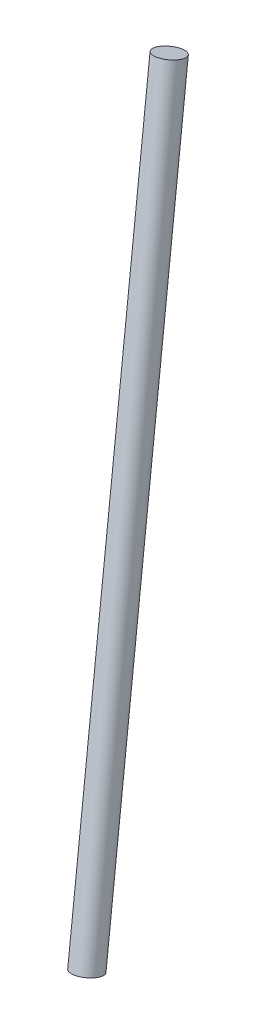
ISO-10303-21;
HEADER;
FILE_DESCRIPTION(('STEP AP214'),'2;1');
FILE_NAME('part.step','',(''),(''),'','','');
FILE_SCHEMA(('AUTOMOTIVE_DESIGN { 1 0 10303 214 1 1 1 1 }'));
ENDSEC;
DATA;
#1=APPLICATION_CONTEXT('core data for automotive mechanical design processes');
#2=APPLICATION_PROTOCOL_DEFINITION('international standard','automotive_design',2000,#1);
#3=PRODUCT_CONTEXT('',#1,'mechanical');
#4=PRODUCT('Part','Part','',(#3));
#5=PRODUCT_RELATED_PRODUCT_CATEGORY('part','',(#4));
#6=PRODUCT_DEFINITION_FORMATION('','',#4);
#7=PRODUCT_DEFINITION_CONTEXT('part definition',#1,'design');
#8=PRODUCT_DEFINITION('design','',#6,#7);
#9=PRODUCT_DEFINITION_SHAPE('','',#8);
#10=(LENGTH_UNIT() NAMED_UNIT(*) SI_UNIT(.MILLI.,.METRE.));
#11=(NAMED_UNIT(*) PLANE_ANGLE_UNIT() SI_UNIT($,.RADIAN.));
#12=(NAMED_UNIT(*) SI_UNIT($,.STERADIAN.) SOLID_ANGLE_UNIT());
#13=UNCERTAINTY_MEASURE_WITH_UNIT(LENGTH_MEASURE(1.E-05),#10,'distance_accuracy_value','');
#14=(GEOMETRIC_REPRESENTATION_CONTEXT(3) GLOBAL_UNCERTAINTY_ASSIGNED_CONTEXT((#13)) GLOBAL_UNIT_ASSIGNED_CONTEXT((#10,
#11,#12)) REPRESENTATION_CONTEXT('',''));
#15=CARTESIAN_POINT('',(0.,0.,0.));
#16=DIRECTION('',(0.,0.,1.));
#17=DIRECTION('',(1.,0.,0.));
#18=AXIS2_PLACEMENT_3D('',#15,#16,#17);
#19=CARTESIAN_POINT('',(4029.55687659563,695.574480356611,309.218380298336));
#20=DIRECTION('',(0.115598230222844,-0.965400157578288,0.233751117467196));
#21=DIRECTION('',(0.,-0.235328748896102,-0.971915829659645));
#22=AXIS2_PLACEMENT_3D('',#19,#20,#21);
#23=PLANE('',#22);
#24=CARTESIAN_POINT('',(4029.55687659563,695.574480356611,309.218380298336));
#25=DIRECTION('',(0.115598230222844,-0.965400157578288,0.233751117467196));
#26=DIRECTION('',(0.,-0.235328748896102,-0.971915829659645));
#27=AXIS2_PLACEMENT_3D('',#24,#25,#26);
#28=CIRCLE('',#27,7.50000000000011);
#29=CARTESIAN_POINT('',(4029.55687659563,693.80951473989,301.929011575888));
#30=VERTEX_POINT('',#29);
#31=EDGE_CURVE('E48',#30,#30,#28,.T.);
#32=ORIENTED_EDGE('',*,*,#31,.F.);
#33=EDGE_LOOP('',(#32));
#34=FACE_BOUND('',#33,.T.);
#35=ADVANCED_FACE('F41',(#34),#23,.F.);
#36=CARTESIAN_POINT('',(4074.02951192032,324.168369141819,399.14647161788));
#37=DIRECTION('',(0.115598230222844,-0.965400157578288,0.233751117467196));
#38=DIRECTION('',(0.,-0.235328748896102,-0.971915829659645));
#39=AXIS2_PLACEMENT_3D('',#36,#37,#38);
#40=PLANE('',#39);
#41=CARTESIAN_POINT('',(4074.02951192032,324.168369141819,399.14647161788));
#42=DIRECTION('',(0.115598230222844,-0.965400157578288,0.233751117467196));
#43=DIRECTION('',(0.,-0.235328748896102,-0.971915829659645));
#44=AXIS2_PLACEMENT_3D('',#41,#42,#43);
#45=CIRCLE('',#44,7.50000000000011);
#46=CARTESIAN_POINT('',(4074.02951192032,322.403403525098,391.857102895433));
#47=VERTEX_POINT('',#46);
#48=EDGE_CURVE('E12',#47,#47,#45,.T.);
#49=ORIENTED_EDGE('',*,*,#48,.T.);
#50=EDGE_LOOP('',(#49));
#51=FACE_BOUND('',#50,.T.);
#52=ADVANCED_FACE('F55',(#51),#40,.T.);
#53=CARTESIAN_POINT('',(4029.55687659563,695.574480356611,309.218380298336));
#54=DIRECTION('',(0.115598230222846,-0.965400157578288,0.233751117467195));
#55=DIRECTION('',(0.,-0.235328748896102,-0.971915829659645));
#56=AXIS2_PLACEMENT_3D('',#53,#54,#55);
#57=CYLINDRICAL_SURFACE('',#56,7.50000000000011);
#58=ORIENTED_EDGE('',*,*,#48,.F.);
#59=EDGE_LOOP('',(#58));
#60=FACE_BOUND('',#59,.T.);
#61=ORIENTED_EDGE('',*,*,#31,.T.);
#62=EDGE_LOOP('',(#61));
#63=FACE_BOUND('',#62,.T.);
#64=ADVANCED_FACE('F57',(#60,#63),#57,.T.);
#65=CLOSED_SHELL('',(#35,#52,#64));
#66=MANIFOLD_SOLID_BREP('B2',#65);
#67=ADVANCED_BREP_SHAPE_REPRESENTATION('',(#18,#66),#14);
#68=SHAPE_DEFINITION_REPRESENTATION(#9,#67);
ENDSEC;
END-ISO-10303-21;
